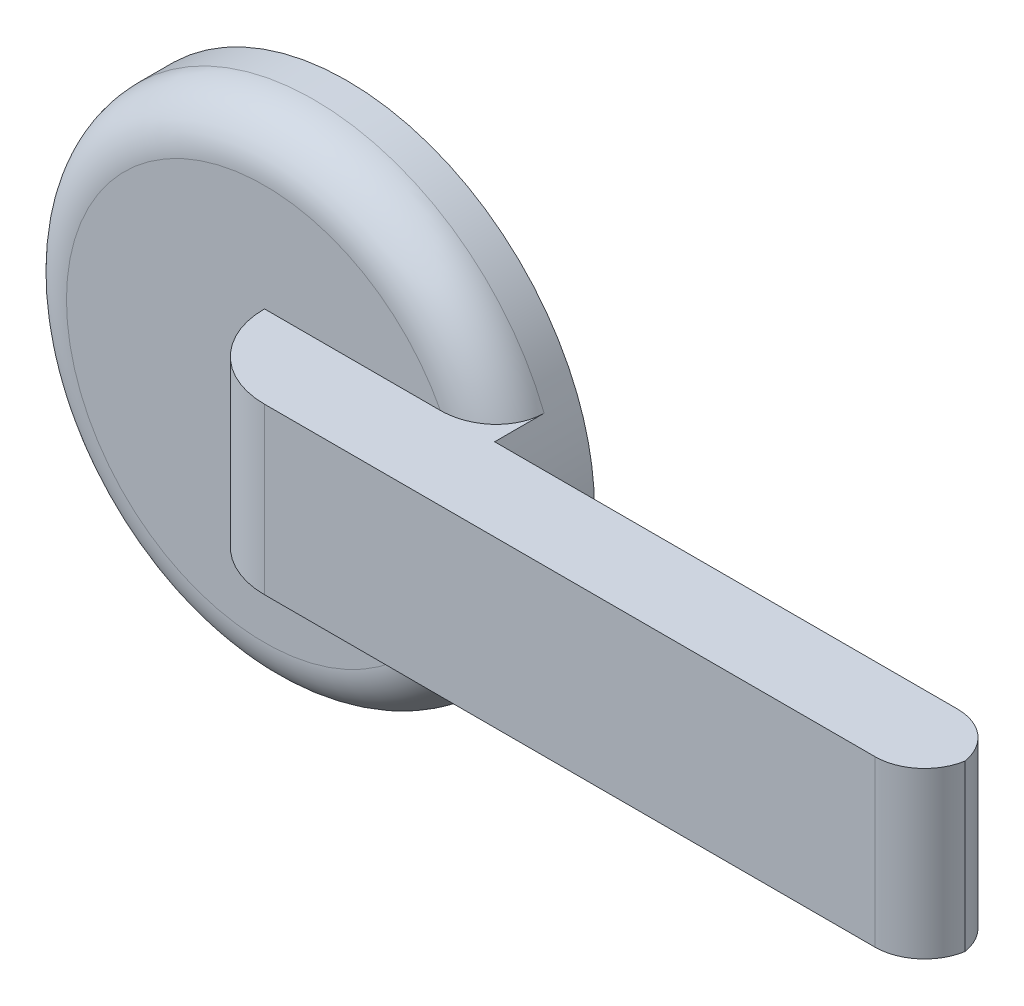
ISO-10303-21;
HEADER;
FILE_DESCRIPTION(('STEP AP214'),'2;1');
FILE_NAME('part.step','',(''),(''),'','','');
FILE_SCHEMA(('AUTOMOTIVE_DESIGN { 1 0 10303 214 1 1 1 1 }'));
ENDSEC;
DATA;
#1=APPLICATION_CONTEXT('core data for automotive mechanical design processes');
#2=APPLICATION_PROTOCOL_DEFINITION('international standard','automotive_design',2000,#1);
#3=PRODUCT_CONTEXT('',#1,'mechanical');
#4=PRODUCT('Part','Part','',(#3));
#5=PRODUCT_RELATED_PRODUCT_CATEGORY('part','',(#4));
#6=PRODUCT_DEFINITION_FORMATION('','',#4);
#7=PRODUCT_DEFINITION_CONTEXT('part definition',#1,'design');
#8=PRODUCT_DEFINITION('design','',#6,#7);
#9=PRODUCT_DEFINITION_SHAPE('','',#8);
#10=(LENGTH_UNIT() NAMED_UNIT(*) SI_UNIT(.MILLI.,.METRE.));
#11=(NAMED_UNIT(*) PLANE_ANGLE_UNIT() SI_UNIT($,.RADIAN.));
#12=(NAMED_UNIT(*) SI_UNIT($,.STERADIAN.) SOLID_ANGLE_UNIT());
#13=UNCERTAINTY_MEASURE_WITH_UNIT(LENGTH_MEASURE(1.E-05),#10,'distance_accuracy_value','');
#14=(GEOMETRIC_REPRESENTATION_CONTEXT(3) GLOBAL_UNCERTAINTY_ASSIGNED_CONTEXT((#13)) GLOBAL_UNIT_ASSIGNED_CONTEXT((#10,
#11,#12)) REPRESENTATION_CONTEXT('',''));
#15=CARTESIAN_POINT('',(0.,0.,0.));
#16=DIRECTION('',(0.,0.,1.));
#17=DIRECTION('',(1.,0.,0.));
#18=AXIS2_PLACEMENT_3D('',#15,#16,#17);
#19=CARTESIAN_POINT('',(0.,0.,12.7));
#20=DIRECTION('',(0.,0.,-1.));
#21=DIRECTION('',(-1.,0.,0.));
#22=AXIS2_PLACEMENT_3D('',#19,#20,#21);
#23=CYLINDRICAL_SURFACE('',#22,38.1);
#24=CARTESIAN_POINT('',(0.,0.,12.7));
#25=DIRECTION('',(0.,0.,1.));
#26=DIRECTION('',(1.,0.,0.));
#27=AXIS2_PLACEMENT_3D('',#24,#25,#26);
#28=CIRCLE('',#27,38.1);
#29=CARTESIAN_POINT('',(36.3584981097938,-11.3872567021265,12.7));
#30=VERTEX_POINT('',#29);
#31=CARTESIAN_POINT('',(35.4295501702731,14.0127432978735,12.7));
#32=VERTEX_POINT('',#31);
#33=EDGE_CURVE('E104',#30,#32,#28,.T.);
#34=ORIENTED_EDGE('',*,*,#33,.F.);
#35=DIRECTION('',(0.,0.,-1.));
#36=VECTOR('',#35,1.);
#37=CARTESIAN_POINT('',(36.3584981097938,-11.3872567021265,12.7));
#38=LINE('',#37,#36);
#39=CARTESIAN_POINT('',(36.3584981097938,-11.3872567021265,5.08));
#40=VERTEX_POINT('',#39);
#41=EDGE_CURVE('E54',#30,#40,#38,.T.);
#42=ORIENTED_EDGE('',*,*,#41,.T.);
#43=CARTESIAN_POINT('',(0.,0.,5.08));
#44=DIRECTION('',(0.,0.,1.));
#45=DIRECTION('',(1.,0.,0.));
#46=AXIS2_PLACEMENT_3D('',#43,#44,#45);
#47=CIRCLE('',#46,38.1);
#48=CARTESIAN_POINT('',(35.4295501702731,14.0127432978735,5.08));
#49=VERTEX_POINT('',#48);
#50=EDGE_CURVE('E107',#40,#49,#47,.F.);
#51=ORIENTED_EDGE('',*,*,#50,.T.);
#52=DIRECTION('',(0.,0.,-1.));
#53=VECTOR('',#52,1.);
#54=CARTESIAN_POINT('',(35.4295501702731,14.0127432978735,5.08));
#55=LINE('',#54,#53);
#56=EDGE_CURVE('E100',#49,#32,#55,.F.);
#57=ORIENTED_EDGE('',*,*,#56,.T.);
#58=EDGE_LOOP('',(#34,#42,#51,#57));
#59=FACE_BOUND('',#58,.T.);
#60=CARTESIAN_POINT('',(0.,0.,0.));
#61=DIRECTION('',(0.,0.,1.));
#62=DIRECTION('',(1.,0.,0.));
#63=AXIS2_PLACEMENT_3D('',#60,#61,#62);
#64=CIRCLE('',#63,38.1);
#65=CARTESIAN_POINT('',(38.1,0.,0.));
#66=VERTEX_POINT('',#65);
#67=EDGE_CURVE('E126',#66,#66,#64,.T.);
#68=ORIENTED_EDGE('',*,*,#67,.T.);
#69=EDGE_LOOP('',(#68));
#70=FACE_BOUND('',#69,.T.);
#71=ADVANCED_FACE('F33',(#59,#70),#23,.T.);
#72=CARTESIAN_POINT('',(0.,0.,12.7));
#73=DIRECTION('',(0.,0.,1.));
#74=DIRECTION('',(1.,0.,0.));
#75=AXIS2_PLACEMENT_3D('',#72,#73,#74);
#76=PLANE('',#75);
#77=DIRECTION('',(-1.,0.,0.));
#78=VECTOR('',#77,1.);
#79=CARTESIAN_POINT('',(0.,14.0127432978735,12.7));
#80=LINE('',#79,#78);
#81=CARTESIAN_POINT('',(27.0679409129675,14.0127432978735,12.7));
#82=VERTEX_POINT('',#81);
#83=CARTESIAN_POINT('',(0.,14.0127432978735,12.7));
#84=VERTEX_POINT('',#83);
#85=EDGE_CURVE('E123',#82,#84,#80,.T.);
#86=ORIENTED_EDGE('',*,*,#85,.F.);
#87=CARTESIAN_POINT('',(0.,0.,12.7));
#88=DIRECTION('',(0.,0.,1.));
#89=DIRECTION('',(1.,0.,0.));
#90=AXIS2_PLACEMENT_3D('',#87,#88,#89);
#91=CIRCLE('',#90,30.48);
#92=CARTESIAN_POINT('',(28.2729691542978,-11.3872567021265,12.7));
#93=VERTEX_POINT('',#92);
#94=EDGE_CURVE('E110',#82,#93,#91,.T.);
#95=ORIENTED_EDGE('',*,*,#94,.T.);
#96=DIRECTION('',(1.,0.,0.));
#97=VECTOR('',#96,1.);
#98=CARTESIAN_POINT('',(0.,-11.3872567021265,12.7));
#99=LINE('',#98,#97);
#100=CARTESIAN_POINT('',(0.,-11.3872567021265,12.7));
#101=VERTEX_POINT('',#100);
#102=EDGE_CURVE('E121',#101,#93,#99,.T.);
#103=ORIENTED_EDGE('',*,*,#102,.F.);
#104=DIRECTION('',(0.,-1.,0.));
#105=VECTOR('',#104,1.);
#106=CARTESIAN_POINT('',(0.,-11.3872567021265,12.7));
#107=LINE('',#106,#105);
#108=EDGE_CURVE('E155',#84,#101,#107,.T.);
#109=ORIENTED_EDGE('',*,*,#108,.F.);
#110=EDGE_LOOP('',(#86,#95,#103,#109));
#111=FACE_BOUND('',#110,.T.);
#112=ADVANCED_FACE('F171',(#111),#76,.T.);
#113=CARTESIAN_POINT('',(0.,0.,0.));
#114=DIRECTION('',(0.,0.,1.));
#115=DIRECTION('',(1.,0.,0.));
#116=AXIS2_PLACEMENT_3D('',#113,#114,#115);
#117=PLANE('',#116);
#118=ORIENTED_EDGE('',*,*,#67,.F.);
#119=EDGE_LOOP('',(#118));
#120=FACE_BOUND('',#119,.T.);
#121=ADVANCED_FACE('F168',(#120),#117,.F.);
#122=CARTESIAN_POINT('',(0.,-11.3872567021265,25.4));
#123=DIRECTION('',(0.,1.,0.));
#124=DIRECTION('',(0.,0.,1.));
#125=AXIS2_PLACEMENT_3D('',#122,#123,#124);
#126=PLANE('',#125);
#127=CARTESIAN_POINT('',(106.68,-11.3872567021265,12.7));
#128=VERTEX_POINT('',#127);
#129=EDGE_CURVE('E125',#30,#128,#99,.T.);
#130=ORIENTED_EDGE('',*,*,#129,.T.);
#131=CARTESIAN_POINT('',(106.68,-11.3872567021265,20.32));
#132=DIRECTION('',(0.,1.,0.));
#133=DIRECTION('',(0.,0.,1.));
#134=AXIS2_PLACEMENT_3D('',#131,#132,#133);
#135=CIRCLE('',#134,7.62);
#136=CARTESIAN_POINT('',(114.193421324537,-11.3872567021265,19.05));
#137=VERTEX_POINT('',#136);
#138=EDGE_CURVE('E148',#128,#137,#135,.F.);
#139=ORIENTED_EDGE('',*,*,#138,.T.);
#140=CARTESIAN_POINT('',(106.68,-11.3872567021265,17.78));
#141=DIRECTION('',(0.,1.,0.));
#142=DIRECTION('',(0.,0.,1.));
#143=AXIS2_PLACEMENT_3D('',#140,#141,#142);
#144=CIRCLE('',#143,7.62);
#145=CARTESIAN_POINT('',(106.68,-11.3872567021265,25.4));
#146=VERTEX_POINT('',#145);
#147=EDGE_CURVE('E146',#137,#146,#144,.F.);
#148=ORIENTED_EDGE('',*,*,#147,.T.);
#149=DIRECTION('',(1.,0.,0.));
#150=VECTOR('',#149,1.);
#151=CARTESIAN_POINT('',(0.,-11.3872567021265,25.4));
#152=LINE('',#151,#150);
#153=CARTESIAN_POINT('',(12.7,-11.3872567021265,25.4));
#154=VERTEX_POINT('',#153);
#155=EDGE_CURVE('E120',#154,#146,#152,.T.);
#156=ORIENTED_EDGE('',*,*,#155,.F.);
#157=CARTESIAN_POINT('',(12.7,-11.3872567021265,12.7));
#158=DIRECTION('',(0.,1.,0.));
#159=DIRECTION('',(0.,0.,1.));
#160=AXIS2_PLACEMENT_3D('',#157,#158,#159);
#161=CIRCLE('',#160,12.7);
#162=EDGE_CURVE('E136',#154,#101,#161,.F.);
#163=ORIENTED_EDGE('',*,*,#162,.T.);
#164=ORIENTED_EDGE('',*,*,#102,.T.);
#165=CARTESIAN_POINT('',(28.2729691542978,-11.3872567021265,12.7));
#166=CARTESIAN_POINT('',(28.5125521202883,-11.3872567021265,12.7000178920823));
#167=CARTESIAN_POINT('',(28.7521542445212,-11.3872567021265,12.6902782862784));
#168=CARTESIAN_POINT('',(29.2298083295511,-11.3872567021265,12.651194021044));
#169=CARTESIAN_POINT('',(29.4678599092537,-11.3872567021265,12.6218447128481));
#170=CARTESIAN_POINT('',(29.9411630267957,-11.3872567021265,12.543375659379));
#171=CARTESIAN_POINT('',(30.1764083131906,-11.3872567021265,12.4942180746472));
#172=CARTESIAN_POINT('',(30.6418899564623,-11.3872567021265,12.3761979496512));
#173=CARTESIAN_POINT('',(30.872126730183,-11.3872567021265,12.307337056039));
#174=CARTESIAN_POINT('',(31.3263087628693,-11.3872567021265,12.1499414338049));
#175=CARTESIAN_POINT('',(31.5502403063732,-11.3872567021265,12.0613670647437));
#176=CARTESIAN_POINT('',(31.9895069505987,-11.3872567021265,11.8649816052046));
#177=CARTESIAN_POINT('',(32.2048422868796,-11.3872567021265,11.757171042294));
#178=CARTESIAN_POINT('',(32.6248776538976,-11.3872567021265,11.5229626397821));
#179=CARTESIAN_POINT('',(32.8295883291142,-11.3872567021265,11.3965839091899));
#180=CARTESIAN_POINT('',(33.2267795267614,-11.3872567021265,11.1258820190945));
#181=CARTESIAN_POINT('',(33.4192607862894,-11.3872567021265,10.9815599426349));
#182=CARTESIAN_POINT('',(33.7812117731486,-11.3872567021265,10.6833058177095));
#183=CARTESIAN_POINT('',(33.951344570973,-11.3872567021265,10.5301781151496));
#184=CARTESIAN_POINT('',(34.2774120980308,-11.3872567021265,10.2094905419955));
#185=CARTESIAN_POINT('',(34.4333477271688,-11.3872567021265,10.0419315874554));
#186=CARTESIAN_POINT('',(34.7296328841486,-11.3872567021265,9.69348226981222));
#187=CARTESIAN_POINT('',(34.8699787156792,-11.3872567021265,9.51258876195372));
#188=CARTESIAN_POINT('',(35.1336997804535,-11.3872567021265,9.13883256955894));
#189=CARTESIAN_POINT('',(35.257076184689,-11.3872567021265,8.9459707122444));
#190=CARTESIAN_POINT('',(35.4792254304156,-11.3872567021265,8.56090345065483));
#191=CARTESIAN_POINT('',(35.5789913407474,-11.3872567021265,8.36927034642066));
#192=CARTESIAN_POINT('',(35.7614352426502,-11.3872567021265,7.97804341143103));
#193=CARTESIAN_POINT('',(35.8441144567768,-11.3872567021265,7.77845015144582));
#194=CARTESIAN_POINT('',(35.9915478535767,-11.3872567021265,7.37299855788508));
#195=CARTESIAN_POINT('',(36.0563218315447,-11.3872567021265,7.16714742460332));
#196=CARTESIAN_POINT('',(36.1674424502579,-11.3872567021265,6.7506116839066));
#197=CARTESIAN_POINT('',(36.2137963135371,-11.3872567021265,6.53992900528385));
#198=CARTESIAN_POINT('',(36.2865718476316,-11.3872567021265,6.12156931917608));
#199=CARTESIAN_POINT('',(36.313542351297,-11.3872567021265,5.91398763472111));
#200=CARTESIAN_POINT('',(36.3495054138194,-11.3872567021265,5.49760547366601));
#201=CARTESIAN_POINT('',(36.3585263990176,-11.3872567021265,5.28880745024417));
#202=CARTESIAN_POINT('',(36.3584981097937,-11.3872567021265,5.08));
#203=B_SPLINE_CURVE_WITH_KNOTS('',3,(#165,#166,#167,#168,#169,#170,#171,#172,#173,#174,#175,
#176,#177,#178,#179,#180,#181,#182,#183,#184,#185,#186,#187,#188,#189,#190,#191,#192,#193,#194,
#195,#196,#197,#198,#199,#200,#201,#202),.UNSPECIFIED.,.F.,.F.,(4,2,2,2,2,2,2,2,2,2,2,2,2,2,2,2,
2,2,4),(0.,0.718579848768901,1.43733010782031,2.15745994369657,2.87752961418889,
3.59906051832038,4.32057163696032,5.04134536333481,5.76207560557988,6.44788766626037,
7.13365622561544,7.81958703388144,8.50547048505283,9.15280565172974,9.80009448543124,
10.4466648147068,11.0929813727704,11.7201875143068,12.3463995672461),.UNSPECIFIED.);
#204=EDGE_CURVE('E47',#93,#40,#203,.T.);
#205=ORIENTED_EDGE('',*,*,#204,.T.);
#206=ORIENTED_EDGE('',*,*,#41,.F.);
#207=EDGE_LOOP('',(#130,#139,#148,#156,#163,#164,#205,#206));
#208=FACE_BOUND('',#207,.T.);
#209=ADVANCED_FACE('F164',(#208),#126,.F.);
#210=CARTESIAN_POINT('',(0.,14.0127432978735,25.4));
#211=DIRECTION('',(0.,-1.,0.));
#212=DIRECTION('',(0.,0.,-1.));
#213=AXIS2_PLACEMENT_3D('',#210,#211,#212);
#214=PLANE('',#213);
#215=CARTESIAN_POINT('',(106.68,14.0127432978735,17.78));
#216=DIRECTION('',(0.,-1.,0.));
#217=DIRECTION('',(0.,0.,-1.));
#218=AXIS2_PLACEMENT_3D('',#215,#216,#217);
#219=CIRCLE('',#218,7.62);
#220=CARTESIAN_POINT('',(106.68,14.0127432978735,25.4));
#221=VERTEX_POINT('',#220);
#222=CARTESIAN_POINT('',(114.193421324537,14.0127432978735,19.05));
#223=VERTEX_POINT('',#222);
#224=EDGE_CURVE('E141',#221,#223,#219,.F.);
#225=ORIENTED_EDGE('',*,*,#224,.T.);
#226=CARTESIAN_POINT('',(106.68,14.0127432978735,20.32));
#227=DIRECTION('',(0.,-1.,0.));
#228=DIRECTION('',(0.,0.,-1.));
#229=AXIS2_PLACEMENT_3D('',#226,#227,#228);
#230=CIRCLE('',#229,7.62);
#231=CARTESIAN_POINT('',(106.68,14.0127432978735,12.7));
#232=VERTEX_POINT('',#231);
#233=EDGE_CURVE('E116',#223,#232,#230,.F.);
#234=ORIENTED_EDGE('',*,*,#233,.T.);
#235=EDGE_CURVE('E113',#232,#32,#80,.T.);
#236=ORIENTED_EDGE('',*,*,#235,.T.);
#237=ORIENTED_EDGE('',*,*,#56,.F.);
#238=CARTESIAN_POINT('',(35.4295501702731,14.0127432978735,5.08));
#239=CARTESIAN_POINT('',(35.4295803137564,14.0127432978735,5.28280467280016));
#240=CARTESIAN_POINT('',(35.4208448636157,14.0127432978735,5.48560172605502));
#241=CARTESIAN_POINT('',(35.3860630500972,14.0127432978735,5.8896736863395));
#242=CARTESIAN_POINT('',(35.3600195212848,14.0127432978735,6.09094883715493));
#243=CARTESIAN_POINT('',(35.2909250174809,14.0127432978735,6.49005614914255));
#244=CARTESIAN_POINT('',(35.2479151652212,14.0127432978735,6.68789543651525));
#245=CARTESIAN_POINT('',(35.1453056569477,14.0127432978735,7.07922242762362));
#246=CARTESIAN_POINT('',(35.0857058457838,14.0127432978735,7.27271009064442));
#247=CARTESIAN_POINT('',(34.9504918095578,14.0127432978735,7.65393563293214));
#248=CARTESIAN_POINT('',(34.8748824473165,14.0127432978735,7.84167523836777));
#249=CARTESIAN_POINT('',(34.7082974569178,14.0127432978735,8.21028641538692));
#250=CARTESIAN_POINT('',(34.617316150086,14.0127432978735,8.39115541849138));
#251=CARTESIAN_POINT('',(34.4208071050021,14.0127432978735,8.74481369632034));
#252=CARTESIAN_POINT('',(34.3152787731971,14.0127432978735,8.91760264097406));
#253=CARTESIAN_POINT('',(34.0905734866624,14.0127432978735,9.25407084234467));
#254=CARTESIAN_POINT('',(33.9713957100151,14.0127432978735,9.41774954959503));
#255=CARTESIAN_POINT('',(33.717271585019,14.0127432978735,9.7389962309722));
#256=CARTESIAN_POINT('',(33.5820086571243,14.0127432978735,9.89631369128554));
#257=CARTESIAN_POINT('',(33.2992885809061,14.0127432978735,10.1995784042936));
#258=CARTESIAN_POINT('',(33.1518309575746,14.0127432978735,10.3455252136482));
#259=CARTESIAN_POINT('',(32.8458781090656,14.0127432978735,10.6253360762556));
#260=CARTESIAN_POINT('',(32.6873830028603,14.0127432978735,10.7592002597105));
#261=CARTESIAN_POINT('',(32.3605185836067,14.0127432978735,11.0142814206557));
#262=CARTESIAN_POINT('',(32.1921485671098,14.0127432978735,11.1354974954327));
#263=CARTESIAN_POINT('',(31.8353238967858,14.0127432978735,11.3723894236921));
#264=CARTESIAN_POINT('',(31.6462769028614,14.0127432978735,11.4871733653801));
#265=CARTESIAN_POINT('',(31.2597863022643,14.0127432978735,11.7014176726245));
#266=CARTESIAN_POINT('',(31.0623454322265,14.0127432978735,11.8008829843234));
#267=CARTESIAN_POINT('',(30.6601519836964,14.0127432978735,11.9843853459307));
#268=CARTESIAN_POINT('',(30.4553911674462,14.0127432978735,12.0684043152811));
#269=CARTESIAN_POINT('',(30.0401757892027,14.0127432978735,12.2207096297282));
#270=CARTESIAN_POINT('',(29.8297228881133,14.0127432978735,12.2890005099746));
#271=CARTESIAN_POINT('',(29.4098693655041,14.0127432978735,12.4082798294203));
#272=CARTESIAN_POINT('',(29.2005827118465,14.0127432978735,12.459670658702));
#273=CARTESIAN_POINT('',(28.7789013191016,14.0127432978735,12.547572699339));
#274=CARTESIAN_POINT('',(28.5665064144483,14.0127432978735,12.5840831150548));
#275=CARTESIAN_POINT('',(28.1402099660567,14.0127432978735,12.6422622587943));
#276=CARTESIAN_POINT('',(27.9263131187901,14.0127432978735,12.6639655630605));
#277=CARTESIAN_POINT('',(27.4975852796096,14.0127432978735,12.6928362608062));
#278=CARTESIAN_POINT('',(27.2827545036727,14.0127432978735,12.7000068527274));
#279=CARTESIAN_POINT('',(27.0679409129675,14.0127432978735,12.7));
#280=B_SPLINE_CURVE_WITH_KNOTS('',3,(#238,#239,#240,#241,#242,#243,#244,#245,#246,#247,#248,
#249,#250,#251,#252,#253,#254,#255,#256,#257,#258,#259,#260,#261,#262,#263,#264,#265,#266,#267,
#268,#269,#270,#271,#272,#273,#274,#275,#276,#277,#278,#279),.UNSPECIFIED.,.F.,.F.,(4,2,2,2,2,2,
2,2,2,2,2,2,2,2,2,2,2,2,2,2,4),(0.,0.608214411990479,1.21632924048983,1.82297909707777,
2.42963462727383,3.03610615255773,3.642802211221,4.24952303183778,4.85628040609476,
5.47801271597068,6.09976925498259,6.72151909316033,7.34331327619657,8.00609504690378,
8.66866236519903,9.33200037435159,9.99514687174166,10.6411146438378,11.2871169505876,
11.9316055595452,12.5759523103884),.UNSPECIFIED.);
#281=EDGE_CURVE('E11',#49,#82,#280,.T.);
#282=ORIENTED_EDGE('',*,*,#281,.T.);
#283=ORIENTED_EDGE('',*,*,#85,.T.);
#284=CARTESIAN_POINT('',(12.7,14.0127432978735,12.7));
#285=DIRECTION('',(0.,-1.,0.));
#286=DIRECTION('',(0.,0.,-1.));
#287=AXIS2_PLACEMENT_3D('',#284,#285,#286);
#288=CIRCLE('',#287,12.7);
#289=CARTESIAN_POINT('',(12.7,14.0127432978735,25.4));
#290=VERTEX_POINT('',#289);
#291=EDGE_CURVE('E138',#84,#290,#288,.F.);
#292=ORIENTED_EDGE('',*,*,#291,.T.);
#293=DIRECTION('',(-1.,0.,0.));
#294=VECTOR('',#293,1.);
#295=CARTESIAN_POINT('',(0.,14.0127432978735,25.4));
#296=LINE('',#295,#294);
#297=EDGE_CURVE('E130',#221,#290,#296,.T.);
#298=ORIENTED_EDGE('',*,*,#297,.F.);
#299=EDGE_LOOP('',(#225,#234,#236,#237,#282,#283,#292,#298));
#300=FACE_BOUND('',#299,.T.);
#301=ADVANCED_FACE('F114',(#300),#214,.F.);
#302=CARTESIAN_POINT('',(0.,0.,25.4));
#303=DIRECTION('',(0.,0.,-1.));
#304=DIRECTION('',(-1.,0.,0.));
#305=AXIS2_PLACEMENT_3D('',#302,#303,#304);
#306=PLANE('',#305);
#307=ORIENTED_EDGE('',*,*,#155,.T.);
#308=DIRECTION('',(0.,1.,0.));
#309=VECTOR('',#308,1.);
#310=CARTESIAN_POINT('',(106.68,0.,25.4));
#311=LINE('',#310,#309);
#312=EDGE_CURVE('E150',#146,#221,#311,.T.);
#313=ORIENTED_EDGE('',*,*,#312,.T.);
#314=ORIENTED_EDGE('',*,*,#297,.T.);
#315=DIRECTION('',(0.,-1.,0.));
#316=VECTOR('',#315,1.);
#317=CARTESIAN_POINT('',(12.7,0.,25.4));
#318=LINE('',#317,#316);
#319=EDGE_CURVE('E128',#290,#154,#318,.T.);
#320=ORIENTED_EDGE('',*,*,#319,.T.);
#321=EDGE_LOOP('',(#307,#313,#314,#320));
#322=FACE_BOUND('',#321,.T.);
#323=ADVANCED_FACE('F199',(#322),#306,.F.);
#324=CARTESIAN_POINT('',(0.,0.,12.7));
#325=DIRECTION('',(0.,0.,-1.));
#326=DIRECTION('',(-1.,0.,0.));
#327=AXIS2_PLACEMENT_3D('',#324,#325,#326);
#328=PLANE('',#327);
#329=ORIENTED_EDGE('',*,*,#235,.F.);
#330=DIRECTION('',(0.,1.,0.));
#331=VECTOR('',#330,1.);
#332=CARTESIAN_POINT('',(106.68,-11.3872567021265,12.7));
#333=LINE('',#332,#331);
#334=EDGE_CURVE('E144',#232,#128,#333,.F.);
#335=ORIENTED_EDGE('',*,*,#334,.T.);
#336=ORIENTED_EDGE('',*,*,#129,.F.);
#337=ORIENTED_EDGE('',*,*,#33,.T.);
#338=EDGE_LOOP('',(#329,#335,#336,#337));
#339=FACE_BOUND('',#338,.T.);
#340=ADVANCED_FACE('F124',(#339),#328,.T.);
#341=CARTESIAN_POINT('',(12.7,0.,12.7));
#342=DIRECTION('',(0.,-1.,0.));
#343=DIRECTION('',(1.,0.,0.));
#344=AXIS2_PLACEMENT_3D('',#341,#342,#343);
#345=CYLINDRICAL_SURFACE('',#344,12.7);
#346=ORIENTED_EDGE('',*,*,#291,.F.);
#347=ORIENTED_EDGE('',*,*,#108,.T.);
#348=ORIENTED_EDGE('',*,*,#162,.F.);
#349=ORIENTED_EDGE('',*,*,#319,.F.);
#350=EDGE_LOOP('',(#346,#347,#348,#349));
#351=FACE_BOUND('',#350,.T.);
#352=ADVANCED_FACE('F180',(#351),#345,.T.);
#353=CARTESIAN_POINT('',(106.68,0.,17.78));
#354=DIRECTION('',(0.,1.,0.));
#355=DIRECTION('',(0.,0.,1.));
#356=AXIS2_PLACEMENT_3D('',#353,#354,#355);
#357=CYLINDRICAL_SURFACE('',#356,7.62);
#358=ORIENTED_EDGE('',*,*,#312,.F.);
#359=ORIENTED_EDGE('',*,*,#147,.F.);
#360=DIRECTION('',(0.,1.,0.));
#361=VECTOR('',#360,1.);
#362=CARTESIAN_POINT('',(114.193421324537,1.31274329787352,19.05));
#363=LINE('',#362,#361);
#364=EDGE_CURVE('E152',#223,#137,#363,.F.);
#365=ORIENTED_EDGE('',*,*,#364,.F.);
#366=ORIENTED_EDGE('',*,*,#224,.F.);
#367=EDGE_LOOP('',(#358,#359,#365,#366));
#368=FACE_BOUND('',#367,.T.);
#369=ADVANCED_FACE('F183',(#368),#357,.T.);
#370=CARTESIAN_POINT('',(106.68,-11.3872567021265,20.32));
#371=DIRECTION('',(0.,-1.,0.));
#372=DIRECTION('',(0.,0.,-1.));
#373=AXIS2_PLACEMENT_3D('',#370,#371,#372);
#374=CYLINDRICAL_SURFACE('',#373,7.62);
#375=ORIENTED_EDGE('',*,*,#138,.F.);
#376=ORIENTED_EDGE('',*,*,#334,.F.);
#377=ORIENTED_EDGE('',*,*,#233,.F.);
#378=ORIENTED_EDGE('',*,*,#364,.T.);
#379=EDGE_LOOP('',(#375,#376,#377,#378));
#380=FACE_BOUND('',#379,.T.);
#381=ADVANCED_FACE('F185',(#380),#374,.T.);
#382=CARTESIAN_POINT('',(0.,0.,5.08));
#383=DIRECTION('',(0.,0.,1.));
#384=DIRECTION('',(1.,0.,0.));
#385=AXIS2_PLACEMENT_3D('',#382,#383,#384);
#386=TOROIDAL_SURFACE('',#385,30.48,7.62);
#387=ORIENTED_EDGE('',*,*,#281,.F.);
#388=ORIENTED_EDGE('',*,*,#50,.F.);
#389=ORIENTED_EDGE('',*,*,#204,.F.);
#390=ORIENTED_EDGE('',*,*,#94,.F.);
#391=EDGE_LOOP('',(#387,#388,#389,#390));
#392=FACE_BOUND('',#391,.T.);
#393=ADVANCED_FACE('F35',(#392),#386,.T.);
#394=CLOSED_SHELL('',(#71,#112,#121,#209,#301,#323,#340,#352,#369,#381,#393));
#395=MANIFOLD_SOLID_BREP('B2',#394);
#396=ADVANCED_BREP_SHAPE_REPRESENTATION('',(#18,#395),#14);
#397=SHAPE_DEFINITION_REPRESENTATION(#9,#396);
ENDSEC;
END-ISO-10303-21;
